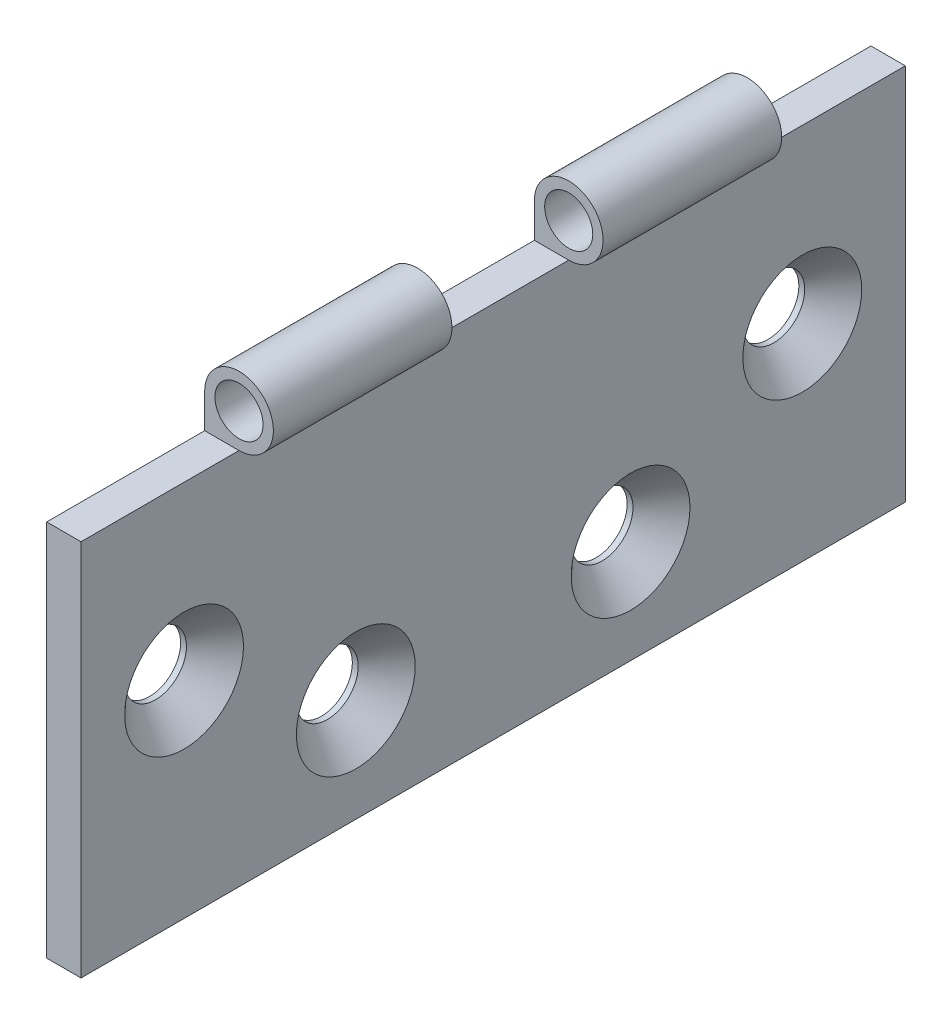
ISO-10303-21;
HEADER;
FILE_DESCRIPTION(('STEP AP214'),'2;1');
FILE_NAME('part.step','',(''),(''),'','','');
FILE_SCHEMA(('AUTOMOTIVE_DESIGN { 1 0 10303 214 1 1 1 1 }'));
ENDSEC;
DATA;
#1=APPLICATION_CONTEXT('core data for automotive mechanical design processes');
#2=APPLICATION_PROTOCOL_DEFINITION('international standard','automotive_design',2000,#1);
#3=PRODUCT_CONTEXT('',#1,'mechanical');
#4=PRODUCT('Part','Part','',(#3));
#5=PRODUCT_RELATED_PRODUCT_CATEGORY('part','',(#4));
#6=PRODUCT_DEFINITION_FORMATION('','',#4);
#7=PRODUCT_DEFINITION_CONTEXT('part definition',#1,'design');
#8=PRODUCT_DEFINITION('design','',#6,#7);
#9=PRODUCT_DEFINITION_SHAPE('','',#8);
#10=(LENGTH_UNIT() NAMED_UNIT(*) SI_UNIT(.MILLI.,.METRE.));
#11=(NAMED_UNIT(*) PLANE_ANGLE_UNIT() SI_UNIT($,.RADIAN.));
#12=(NAMED_UNIT(*) SI_UNIT($,.STERADIAN.) SOLID_ANGLE_UNIT());
#13=UNCERTAINTY_MEASURE_WITH_UNIT(LENGTH_MEASURE(1.E-05),#10,'distance_accuracy_value','');
#14=(GEOMETRIC_REPRESENTATION_CONTEXT(3) GLOBAL_UNCERTAINTY_ASSIGNED_CONTEXT((#13)) GLOBAL_UNIT_ASSIGNED_CONTEXT((#10,
#11,#12)) REPRESENTATION_CONTEXT('',''));
#15=CARTESIAN_POINT('',(0.,0.,0.));
#16=DIRECTION('',(0.,0.,1.));
#17=DIRECTION('',(1.,0.,0.));
#18=AXIS2_PLACEMENT_3D('',#15,#16,#17);
#19=CARTESIAN_POINT('',(0.,0.,60.));
#20=DIRECTION('',(-1.,0.,0.));
#21=DIRECTION('',(0.,0.,1.));
#22=AXIS2_PLACEMENT_3D('',#19,#20,#21);
#23=PLANE('',#22);
#24=CARTESIAN_POINT('',(0.,30.,-45.));
#25=DIRECTION('',(1.,0.,0.));
#26=DIRECTION('',(0.,0.,-1.));
#27=AXIS2_PLACEMENT_3D('',#24,#25,#26);
#28=CIRCLE('',#27,4.5);
#29=CARTESIAN_POINT('',(0.,30.,-49.5));
#30=VERTEX_POINT('',#29);
#31=EDGE_CURVE('E146',#30,#30,#28,.T.);
#32=ORIENTED_EDGE('',*,*,#31,.T.);
#33=EDGE_LOOP('',(#32));
#34=FACE_BOUND('',#33,.T.);
#35=CARTESIAN_POINT('',(0.,15.,-20.));
#36=DIRECTION('',(1.,0.,0.));
#37=DIRECTION('',(0.,0.,-1.));
#38=AXIS2_PLACEMENT_3D('',#35,#36,#37);
#39=CIRCLE('',#38,4.5);
#40=CARTESIAN_POINT('',(0.,15.,-24.5));
#41=VERTEX_POINT('',#40);
#42=EDGE_CURVE('E155',#41,#41,#39,.T.);
#43=ORIENTED_EDGE('',*,*,#42,.T.);
#44=EDGE_LOOP('',(#43));
#45=FACE_BOUND('',#44,.T.);
#46=CARTESIAN_POINT('',(0.,30.,45.));
#47=DIRECTION('',(1.,0.,0.));
#48=DIRECTION('',(0.,0.,-1.));
#49=AXIS2_PLACEMENT_3D('',#46,#47,#48);
#50=CIRCLE('',#49,4.5);
#51=CARTESIAN_POINT('',(0.,30.,40.5));
#52=VERTEX_POINT('',#51);
#53=EDGE_CURVE('E164',#52,#52,#50,.T.);
#54=ORIENTED_EDGE('',*,*,#53,.T.);
#55=EDGE_LOOP('',(#54));
#56=FACE_BOUND('',#55,.T.);
#57=CARTESIAN_POINT('',(0.,15.,20.));
#58=DIRECTION('',(1.,0.,0.));
#59=DIRECTION('',(0.,0.,-1.));
#60=AXIS2_PLACEMENT_3D('',#57,#58,#59);
#61=CIRCLE('',#60,4.5);
#62=CARTESIAN_POINT('',(0.,15.,15.5));
#63=VERTEX_POINT('',#62);
#64=EDGE_CURVE('E173',#63,#63,#61,.T.);
#65=ORIENTED_EDGE('',*,*,#64,.T.);
#66=EDGE_LOOP('',(#65));
#67=FACE_BOUND('',#66,.T.);
#68=DIRECTION('',(0.,0.,1.));
#69=VECTOR('',#68,1.);
#70=CARTESIAN_POINT('',(0.,55.,0.));
#71=LINE('',#70,#69);
#72=CARTESIAN_POINT('',(0.,55.,37.));
#73=VERTEX_POINT('',#72);
#74=CARTESIAN_POINT('',(0.,55.,60.));
#75=VERTEX_POINT('',#74);
#76=EDGE_CURVE('E51',#73,#75,#71,.T.);
#77=ORIENTED_EDGE('',*,*,#76,.F.);
#78=DIRECTION('',(0.,-1.,0.));
#79=VECTOR('',#78,1.);
#80=CARTESIAN_POINT('',(0.,0.,37.));
#81=LINE('',#80,#79);
#82=CARTESIAN_POINT('',(0.,60.,37.));
#83=VERTEX_POINT('',#82);
#84=EDGE_CURVE('E499',#83,#73,#81,.T.);
#85=ORIENTED_EDGE('',*,*,#84,.F.);
#86=DIRECTION('',(0.,0.,-1.));
#87=VECTOR('',#86,1.);
#88=CARTESIAN_POINT('',(0.,60.,60.));
#89=LINE('',#88,#87);
#90=CARTESIAN_POINT('',(0.,60.,11.));
#91=VERTEX_POINT('',#90);
#92=EDGE_CURVE('E11',#83,#91,#89,.T.);
#93=ORIENTED_EDGE('',*,*,#92,.T.);
#94=DIRECTION('',(0.,-1.,0.));
#95=VECTOR('',#94,1.);
#96=CARTESIAN_POINT('',(0.,0.,11.));
#97=LINE('',#96,#95);
#98=CARTESIAN_POINT('',(0.,55.,11.));
#99=VERTEX_POINT('',#98);
#100=EDGE_CURVE('E248',#91,#99,#97,.T.);
#101=ORIENTED_EDGE('',*,*,#100,.T.);
#102=DIRECTION('',(0.,0.,1.));
#103=VECTOR('',#102,1.);
#104=CARTESIAN_POINT('',(0.,55.,0.));
#105=LINE('',#104,#103);
#106=CARTESIAN_POINT('',(0.,55.,-11.));
#107=VERTEX_POINT('',#106);
#108=EDGE_CURVE('E247',#107,#99,#105,.T.);
#109=ORIENTED_EDGE('',*,*,#108,.F.);
#110=DIRECTION('',(0.,-1.,0.));
#111=VECTOR('',#110,1.);
#112=CARTESIAN_POINT('',(0.,0.,-11.));
#113=LINE('',#112,#111);
#114=CARTESIAN_POINT('',(0.,60.,-11.));
#115=VERTEX_POINT('',#114);
#116=EDGE_CURVE('E240',#115,#107,#113,.T.);
#117=ORIENTED_EDGE('',*,*,#116,.F.);
#118=CARTESIAN_POINT('',(0.,60.,-37.));
#119=VERTEX_POINT('',#118);
#120=EDGE_CURVE('E43',#115,#119,#89,.T.);
#121=ORIENTED_EDGE('',*,*,#120,.T.);
#122=DIRECTION('',(0.,-1.,0.));
#123=VECTOR('',#122,1.);
#124=CARTESIAN_POINT('',(0.,0.,-37.));
#125=LINE('',#124,#123);
#126=CARTESIAN_POINT('',(0.,55.,-37.));
#127=VERTEX_POINT('',#126);
#128=EDGE_CURVE('E115',#119,#127,#125,.T.);
#129=ORIENTED_EDGE('',*,*,#128,.T.);
#130=DIRECTION('',(0.,0.,1.));
#131=VECTOR('',#130,1.);
#132=CARTESIAN_POINT('',(0.,55.,0.));
#133=LINE('',#132,#131);
#134=CARTESIAN_POINT('',(0.,55.,-60.));
#135=VERTEX_POINT('',#134);
#136=EDGE_CURVE('E131',#135,#127,#133,.T.);
#137=ORIENTED_EDGE('',*,*,#136,.F.);
#138=DIRECTION('',(0.,1.,0.));
#139=VECTOR('',#138,1.);
#140=CARTESIAN_POINT('',(0.,0.,-60.));
#141=LINE('',#140,#139);
#142=CARTESIAN_POINT('',(0.,0.,-60.));
#143=VERTEX_POINT('',#142);
#144=EDGE_CURVE('E90',#143,#135,#141,.T.);
#145=ORIENTED_EDGE('',*,*,#144,.F.);
#146=DIRECTION('',(0.,0.,-1.));
#147=VECTOR('',#146,1.);
#148=CARTESIAN_POINT('',(0.,0.,60.));
#149=LINE('',#148,#147);
#150=CARTESIAN_POINT('',(0.,0.,60.));
#151=VERTEX_POINT('',#150);
#152=EDGE_CURVE('E79',#151,#143,#149,.T.);
#153=ORIENTED_EDGE('',*,*,#152,.F.);
#154=DIRECTION('',(0.,1.,0.));
#155=VECTOR('',#154,1.);
#156=CARTESIAN_POINT('',(0.,0.,60.));
#157=LINE('',#156,#155);
#158=EDGE_CURVE('E96',#151,#75,#157,.T.);
#159=ORIENTED_EDGE('',*,*,#158,.T.);
#160=EDGE_LOOP('',(#77,#85,#93,#101,#109,#117,#121,#129,#137,#145,#153,#159));
#161=FACE_BOUND('',#160,.T.);
#162=ADVANCED_FACE('F34',(#34,#45,#56,#67,#161),#23,.T.);
#163=CARTESIAN_POINT('',(5.,60.,-60.));
#164=DIRECTION('',(0.,0.,1.));
#165=DIRECTION('',(1.,0.,0.));
#166=AXIS2_PLACEMENT_3D('',#163,#164,#165);
#167=CYLINDRICAL_SURFACE('',#166,5.);
#168=ORIENTED_EDGE('',*,*,#92,.F.);
#169=CARTESIAN_POINT('',(5.,60.,37.));
#170=DIRECTION('',(0.,0.,1.));
#171=DIRECTION('',(0.,-1.,0.));
#172=AXIS2_PLACEMENT_3D('',#169,#170,#171);
#173=CIRCLE('',#172,5.);
#174=CARTESIAN_POINT('',(5.,55.,37.));
#175=VERTEX_POINT('',#174);
#176=EDGE_CURVE('E227',#83,#175,#173,.F.);
#177=ORIENTED_EDGE('',*,*,#176,.T.);
#178=DIRECTION('',(0.,0.,1.));
#179=VECTOR('',#178,1.);
#180=CARTESIAN_POINT('',(5.,55.,-60.));
#181=LINE('',#180,#179);
#182=CARTESIAN_POINT('',(5.,55.,11.));
#183=VERTEX_POINT('',#182);
#184=EDGE_CURVE('E176',#183,#175,#181,.T.);
#185=ORIENTED_EDGE('',*,*,#184,.F.);
#186=CARTESIAN_POINT('',(5.,60.,11.));
#187=DIRECTION('',(0.,0.,1.));
#188=DIRECTION('',(1.,0.,0.));
#189=AXIS2_PLACEMENT_3D('',#186,#187,#188);
#190=CIRCLE('',#189,5.);
#191=EDGE_CURVE('E107',#91,#183,#190,.F.);
#192=ORIENTED_EDGE('',*,*,#191,.F.);
#193=EDGE_LOOP('',(#168,#177,#185,#192));
#194=FACE_BOUND('',#193,.T.);
#195=ADVANCED_FACE('F225',(#194),#167,.T.);
#196=CARTESIAN_POINT('',(0.,0.,60.));
#197=DIRECTION('',(0.,0.,-1.));
#198=DIRECTION('',(-1.,0.,0.));
#199=AXIS2_PLACEMENT_3D('',#196,#197,#198);
#200=PLANE('',#199);
#201=DIRECTION('',(1.,0.,0.));
#202=VECTOR('',#201,1.);
#203=CARTESIAN_POINT('',(0.,55.,60.));
#204=LINE('',#203,#202);
#205=CARTESIAN_POINT('',(5.,55.,60.));
#206=VERTEX_POINT('',#205);
#207=EDGE_CURVE('E185',#75,#206,#204,.T.);
#208=ORIENTED_EDGE('',*,*,#207,.F.);
#209=ORIENTED_EDGE('',*,*,#158,.F.);
#210=DIRECTION('',(-1.,0.,0.));
#211=VECTOR('',#210,1.);
#212=CARTESIAN_POINT('',(5.,0.,60.));
#213=LINE('',#212,#211);
#214=CARTESIAN_POINT('',(5.,0.,60.));
#215=VERTEX_POINT('',#214);
#216=EDGE_CURVE('E80',#215,#151,#213,.T.);
#217=ORIENTED_EDGE('',*,*,#216,.F.);
#218=DIRECTION('',(0.,1.,0.));
#219=VECTOR('',#218,1.);
#220=CARTESIAN_POINT('',(5.,0.,60.));
#221=LINE('',#220,#219);
#222=EDGE_CURVE('E77',#215,#206,#221,.T.);
#223=ORIENTED_EDGE('',*,*,#222,.T.);
#224=EDGE_LOOP('',(#208,#209,#217,#223));
#225=FACE_BOUND('',#224,.T.);
#226=ADVANCED_FACE('F183',(#225),#200,.F.);
#227=CARTESIAN_POINT('',(5.,60.,-60.));
#228=DIRECTION('',(0.,0.,1.));
#229=DIRECTION('',(1.,0.,0.));
#230=AXIS2_PLACEMENT_3D('',#227,#228,#229);
#231=CYLINDRICAL_SURFACE('',#230,3.5);
#232=CARTESIAN_POINT('',(5.,60.,11.));
#233=DIRECTION('',(0.,0.,1.));
#234=DIRECTION('',(1.,0.,0.));
#235=AXIS2_PLACEMENT_3D('',#232,#233,#234);
#236=CIRCLE('',#235,3.5);
#237=CARTESIAN_POINT('',(8.5,60.,11.));
#238=VERTEX_POINT('',#237);
#239=EDGE_CURVE('E105',#238,#238,#236,.F.);
#240=ORIENTED_EDGE('',*,*,#239,.T.);
#241=EDGE_LOOP('',(#240));
#242=FACE_BOUND('',#241,.T.);
#243=CARTESIAN_POINT('',(5.,60.,37.));
#244=DIRECTION('',(0.,0.,1.));
#245=DIRECTION('',(0.,-1.,0.));
#246=AXIS2_PLACEMENT_3D('',#243,#244,#245);
#247=CIRCLE('',#246,3.5);
#248=CARTESIAN_POINT('',(5.,56.5,37.));
#249=VERTEX_POINT('',#248);
#250=EDGE_CURVE('E38',#249,#249,#247,.F.);
#251=ORIENTED_EDGE('',*,*,#250,.F.);
#252=EDGE_LOOP('',(#251));
#253=FACE_BOUND('',#252,.T.);
#254=ADVANCED_FACE('F263',(#242,#253),#231,.F.);
#255=CARTESIAN_POINT('',(5.,60.,-11.));
#256=DIRECTION('',(0.,0.,1.));
#257=DIRECTION('',(1.,0.,0.));
#258=AXIS2_PLACEMENT_3D('',#255,#256,#257);
#259=CIRCLE('',#258,5.);
#260=CARTESIAN_POINT('',(5.,55.,-11.));
#261=VERTEX_POINT('',#260);
#262=EDGE_CURVE('E111',#115,#261,#259,.F.);
#263=ORIENTED_EDGE('',*,*,#262,.T.);
#264=CARTESIAN_POINT('',(5.,55.,-37.));
#265=VERTEX_POINT('',#264);
#266=EDGE_CURVE('E177',#265,#261,#181,.T.);
#267=ORIENTED_EDGE('',*,*,#266,.F.);
#268=CARTESIAN_POINT('',(5.,60.,-37.));
#269=DIRECTION('',(0.,0.,1.));
#270=DIRECTION('',(0.,-1.,0.));
#271=AXIS2_PLACEMENT_3D('',#268,#269,#270);
#272=CIRCLE('',#271,5.);
#273=EDGE_CURVE('E104',#119,#265,#272,.F.);
#274=ORIENTED_EDGE('',*,*,#273,.F.);
#275=ORIENTED_EDGE('',*,*,#120,.F.);
#276=EDGE_LOOP('',(#263,#267,#274,#275));
#277=FACE_BOUND('',#276,.T.);
#278=ADVANCED_FACE('F250',(#277),#167,.T.);
#279=CARTESIAN_POINT('',(5.,60.,-37.));
#280=DIRECTION('',(0.,0.,1.));
#281=DIRECTION('',(0.,-1.,0.));
#282=AXIS2_PLACEMENT_3D('',#279,#280,#281);
#283=CIRCLE('',#282,3.5);
#284=CARTESIAN_POINT('',(5.,56.5,-37.));
#285=VERTEX_POINT('',#284);
#286=EDGE_CURVE('E101',#285,#285,#283,.F.);
#287=ORIENTED_EDGE('',*,*,#286,.T.);
#288=EDGE_LOOP('',(#287));
#289=FACE_BOUND('',#288,.T.);
#290=CARTESIAN_POINT('',(5.,60.,-11.));
#291=DIRECTION('',(0.,0.,1.));
#292=DIRECTION('',(1.,0.,0.));
#293=AXIS2_PLACEMENT_3D('',#290,#291,#292);
#294=CIRCLE('',#293,3.5);
#295=CARTESIAN_POINT('',(8.5,60.,-11.));
#296=VERTEX_POINT('',#295);
#297=EDGE_CURVE('E109',#296,#296,#294,.F.);
#298=ORIENTED_EDGE('',*,*,#297,.F.);
#299=EDGE_LOOP('',(#298));
#300=FACE_BOUND('',#299,.T.);
#301=ADVANCED_FACE('F259',(#289,#300),#231,.F.);
#302=CARTESIAN_POINT('',(0.,0.,-60.));
#303=DIRECTION('',(0.,0.,-1.));
#304=DIRECTION('',(-1.,0.,0.));
#305=AXIS2_PLACEMENT_3D('',#302,#303,#304);
#306=PLANE('',#305);
#307=ORIENTED_EDGE('',*,*,#144,.T.);
#308=DIRECTION('',(1.,0.,0.));
#309=VECTOR('',#308,1.);
#310=CARTESIAN_POINT('',(0.,55.,-60.));
#311=LINE('',#310,#309);
#312=CARTESIAN_POINT('',(5.,55.,-60.));
#313=VERTEX_POINT('',#312);
#314=EDGE_CURVE('E89',#135,#313,#311,.T.);
#315=ORIENTED_EDGE('',*,*,#314,.T.);
#316=DIRECTION('',(0.,1.,0.));
#317=VECTOR('',#316,1.);
#318=CARTESIAN_POINT('',(5.,0.,-60.));
#319=LINE('',#318,#317);
#320=CARTESIAN_POINT('',(5.,0.,-60.));
#321=VERTEX_POINT('',#320);
#322=EDGE_CURVE('E74',#321,#313,#319,.T.);
#323=ORIENTED_EDGE('',*,*,#322,.F.);
#324=DIRECTION('',(-1.,0.,0.));
#325=VECTOR('',#324,1.);
#326=CARTESIAN_POINT('',(5.,0.,-60.));
#327=LINE('',#326,#325);
#328=EDGE_CURVE('E87',#321,#143,#327,.T.);
#329=ORIENTED_EDGE('',*,*,#328,.T.);
#330=EDGE_LOOP('',(#307,#315,#323,#329));
#331=FACE_BOUND('',#330,.T.);
#332=ADVANCED_FACE('F86',(#331),#306,.T.);
#333=CARTESIAN_POINT('',(5.,0.,60.));
#334=DIRECTION('',(-1.,0.,0.));
#335=DIRECTION('',(0.,0.,1.));
#336=AXIS2_PLACEMENT_3D('',#333,#334,#335);
#337=PLANE('',#336);
#338=CARTESIAN_POINT('',(5.,30.,-45.));
#339=DIRECTION('',(1.,0.,0.));
#340=DIRECTION('',(0.,0.,-1.));
#341=AXIS2_PLACEMENT_3D('',#338,#339,#340);
#342=CIRCLE('',#341,8.65);
#343=CARTESIAN_POINT('',(5.,30.,-53.65));
#344=VERTEX_POINT('',#343);
#345=EDGE_CURVE('E140',#344,#344,#342,.T.);
#346=ORIENTED_EDGE('',*,*,#345,.F.);
#347=EDGE_LOOP('',(#346));
#348=FACE_BOUND('',#347,.T.);
#349=CARTESIAN_POINT('',(5.,15.,-20.));
#350=DIRECTION('',(1.,0.,0.));
#351=DIRECTION('',(0.,0.,-1.));
#352=AXIS2_PLACEMENT_3D('',#349,#350,#351);
#353=CIRCLE('',#352,8.65);
#354=CARTESIAN_POINT('',(5.,15.,-28.65));
#355=VERTEX_POINT('',#354);
#356=EDGE_CURVE('E149',#355,#355,#353,.T.);
#357=ORIENTED_EDGE('',*,*,#356,.F.);
#358=EDGE_LOOP('',(#357));
#359=FACE_BOUND('',#358,.T.);
#360=CARTESIAN_POINT('',(5.,30.,45.));
#361=DIRECTION('',(1.,0.,0.));
#362=DIRECTION('',(0.,0.,-1.));
#363=AXIS2_PLACEMENT_3D('',#360,#361,#362);
#364=CIRCLE('',#363,8.65);
#365=CARTESIAN_POINT('',(5.,30.,36.35));
#366=VERTEX_POINT('',#365);
#367=EDGE_CURVE('E158',#366,#366,#364,.T.);
#368=ORIENTED_EDGE('',*,*,#367,.F.);
#369=EDGE_LOOP('',(#368));
#370=FACE_BOUND('',#369,.T.);
#371=CARTESIAN_POINT('',(5.,15.,20.));
#372=DIRECTION('',(1.,0.,0.));
#373=DIRECTION('',(0.,0.,-1.));
#374=AXIS2_PLACEMENT_3D('',#371,#372,#373);
#375=CIRCLE('',#374,8.65);
#376=CARTESIAN_POINT('',(5.,15.,11.35));
#377=VERTEX_POINT('',#376);
#378=EDGE_CURVE('E167',#377,#377,#375,.T.);
#379=ORIENTED_EDGE('',*,*,#378,.F.);
#380=EDGE_LOOP('',(#379));
#381=FACE_BOUND('',#380,.T.);
#382=ORIENTED_EDGE('',*,*,#322,.T.);
#383=EDGE_CURVE('E91',#313,#265,#181,.T.);
#384=ORIENTED_EDGE('',*,*,#383,.T.);
#385=ORIENTED_EDGE('',*,*,#266,.T.);
#386=EDGE_CURVE('E211',#261,#183,#181,.T.);
#387=ORIENTED_EDGE('',*,*,#386,.T.);
#388=ORIENTED_EDGE('',*,*,#184,.T.);
#389=DIRECTION('',(0.,0.,-1.));
#390=VECTOR('',#389,1.);
#391=CARTESIAN_POINT('',(5.,55.,60.));
#392=LINE('',#391,#390);
#393=EDGE_CURVE('E219',#206,#175,#392,.T.);
#394=ORIENTED_EDGE('',*,*,#393,.F.);
#395=ORIENTED_EDGE('',*,*,#222,.F.);
#396=DIRECTION('',(0.,0.,-1.));
#397=VECTOR('',#396,1.);
#398=CARTESIAN_POINT('',(5.,0.,60.));
#399=LINE('',#398,#397);
#400=EDGE_CURVE('E60',#215,#321,#399,.T.);
#401=ORIENTED_EDGE('',*,*,#400,.T.);
#402=EDGE_LOOP('',(#382,#384,#385,#387,#388,#394,#395,#401));
#403=FACE_BOUND('',#402,.T.);
#404=ADVANCED_FACE('F36',(#348,#359,#370,#381,#403),#337,.F.);
#405=CARTESIAN_POINT('',(5.,0.,60.));
#406=DIRECTION('',(0.,-1.,0.));
#407=DIRECTION('',(0.,0.,-1.));
#408=AXIS2_PLACEMENT_3D('',#405,#406,#407);
#409=PLANE('',#408);
#410=ORIENTED_EDGE('',*,*,#328,.F.);
#411=ORIENTED_EDGE('',*,*,#400,.F.);
#412=ORIENTED_EDGE('',*,*,#216,.T.);
#413=ORIENTED_EDGE('',*,*,#152,.T.);
#414=EDGE_LOOP('',(#410,#411,#412,#413));
#415=FACE_BOUND('',#414,.T.);
#416=ADVANCED_FACE('F93',(#415),#409,.T.);
#417=CARTESIAN_POINT('',(5.,15.,20.));
#418=DIRECTION('',(1.,0.,0.));
#419=DIRECTION('',(0.,0.,-1.));
#420=AXIS2_PLACEMENT_3D('',#417,#418,#419);
#421=CYLINDRICAL_SURFACE('',#420,4.5);
#422=ORIENTED_EDGE('',*,*,#64,.F.);
#423=EDGE_LOOP('',(#422));
#424=FACE_BOUND('',#423,.T.);
#425=CARTESIAN_POINT('',(0.850000000000003,15.,20.));
#426=DIRECTION('',(1.,0.,0.));
#427=DIRECTION('',(0.,0.,-1.));
#428=AXIS2_PLACEMENT_3D('',#425,#426,#427);
#429=CIRCLE('',#428,4.5);
#430=CARTESIAN_POINT('',(0.850000000000003,15.,15.5));
#431=VERTEX_POINT('',#430);
#432=EDGE_CURVE('E170',#431,#431,#429,.T.);
#433=ORIENTED_EDGE('',*,*,#432,.T.);
#434=EDGE_LOOP('',(#433));
#435=FACE_BOUND('',#434,.T.);
#436=ADVANCED_FACE('F282',(#424,#435),#421,.F.);
#437=CARTESIAN_POINT('',(5.,15.,20.));
#438=DIRECTION('',(1.,0.,0.));
#439=DIRECTION('',(0.,0.,-1.));
#440=AXIS2_PLACEMENT_3D('',#437,#438,#439);
#441=CONICAL_SURFACE('',#440,8.65,0.785398163397448);
#442=ORIENTED_EDGE('',*,*,#432,.F.);
#443=EDGE_LOOP('',(#442));
#444=FACE_BOUND('',#443,.T.);
#445=ORIENTED_EDGE('',*,*,#378,.T.);
#446=EDGE_LOOP('',(#445));
#447=FACE_BOUND('',#446,.T.);
#448=ADVANCED_FACE('F412',(#444,#447),#441,.F.);
#449=CARTESIAN_POINT('',(5.,30.,45.));
#450=DIRECTION('',(1.,0.,0.));
#451=DIRECTION('',(0.,0.,-1.));
#452=AXIS2_PLACEMENT_3D('',#449,#450,#451);
#453=CYLINDRICAL_SURFACE('',#452,4.5);
#454=ORIENTED_EDGE('',*,*,#53,.F.);
#455=EDGE_LOOP('',(#454));
#456=FACE_BOUND('',#455,.T.);
#457=CARTESIAN_POINT('',(0.850000000000003,30.,45.));
#458=DIRECTION('',(1.,0.,0.));
#459=DIRECTION('',(0.,0.,-1.));
#460=AXIS2_PLACEMENT_3D('',#457,#458,#459);
#461=CIRCLE('',#460,4.5);
#462=CARTESIAN_POINT('',(0.850000000000003,30.,40.5));
#463=VERTEX_POINT('',#462);
#464=EDGE_CURVE('E161',#463,#463,#461,.T.);
#465=ORIENTED_EDGE('',*,*,#464,.T.);
#466=EDGE_LOOP('',(#465));
#467=FACE_BOUND('',#466,.T.);
#468=ADVANCED_FACE('F408',(#456,#467),#453,.F.);
#469=CARTESIAN_POINT('',(5.,30.,45.));
#470=DIRECTION('',(1.,0.,0.));
#471=DIRECTION('',(0.,0.,-1.));
#472=AXIS2_PLACEMENT_3D('',#469,#470,#471);
#473=CONICAL_SURFACE('',#472,8.65,0.785398163397449);
#474=ORIENTED_EDGE('',*,*,#464,.F.);
#475=EDGE_LOOP('',(#474));
#476=FACE_BOUND('',#475,.T.);
#477=ORIENTED_EDGE('',*,*,#367,.T.);
#478=EDGE_LOOP('',(#477));
#479=FACE_BOUND('',#478,.T.);
#480=ADVANCED_FACE('F404',(#476,#479),#473,.F.);
#481=CARTESIAN_POINT('',(5.,15.,-20.));
#482=DIRECTION('',(1.,0.,0.));
#483=DIRECTION('',(0.,0.,-1.));
#484=AXIS2_PLACEMENT_3D('',#481,#482,#483);
#485=CYLINDRICAL_SURFACE('',#484,4.5);
#486=ORIENTED_EDGE('',*,*,#42,.F.);
#487=EDGE_LOOP('',(#486));
#488=FACE_BOUND('',#487,.T.);
#489=CARTESIAN_POINT('',(0.850000000000003,15.,-20.));
#490=DIRECTION('',(1.,0.,0.));
#491=DIRECTION('',(0.,0.,-1.));
#492=AXIS2_PLACEMENT_3D('',#489,#490,#491);
#493=CIRCLE('',#492,4.5);
#494=CARTESIAN_POINT('',(0.850000000000003,15.,-24.5));
#495=VERTEX_POINT('',#494);
#496=EDGE_CURVE('E152',#495,#495,#493,.T.);
#497=ORIENTED_EDGE('',*,*,#496,.T.);
#498=EDGE_LOOP('',(#497));
#499=FACE_BOUND('',#498,.T.);
#500=ADVANCED_FACE('F400',(#488,#499),#485,.F.);
#501=CARTESIAN_POINT('',(5.,15.,-20.));
#502=DIRECTION('',(1.,0.,0.));
#503=DIRECTION('',(0.,0.,-1.));
#504=AXIS2_PLACEMENT_3D('',#501,#502,#503);
#505=CONICAL_SURFACE('',#504,8.65,0.785398163397448);
#506=ORIENTED_EDGE('',*,*,#496,.F.);
#507=EDGE_LOOP('',(#506));
#508=FACE_BOUND('',#507,.T.);
#509=ORIENTED_EDGE('',*,*,#356,.T.);
#510=EDGE_LOOP('',(#509));
#511=FACE_BOUND('',#510,.T.);
#512=ADVANCED_FACE('F396',(#508,#511),#505,.F.);
#513=CARTESIAN_POINT('',(5.,30.,-45.));
#514=DIRECTION('',(1.,0.,0.));
#515=DIRECTION('',(0.,0.,-1.));
#516=AXIS2_PLACEMENT_3D('',#513,#514,#515);
#517=CYLINDRICAL_SURFACE('',#516,4.5);
#518=ORIENTED_EDGE('',*,*,#31,.F.);
#519=EDGE_LOOP('',(#518));
#520=FACE_BOUND('',#519,.T.);
#521=CARTESIAN_POINT('',(0.850000000000003,30.,-45.));
#522=DIRECTION('',(1.,0.,0.));
#523=DIRECTION('',(0.,0.,-1.));
#524=AXIS2_PLACEMENT_3D('',#521,#522,#523);
#525=CIRCLE('',#524,4.5);
#526=CARTESIAN_POINT('',(0.850000000000003,30.,-49.5));
#527=VERTEX_POINT('',#526);
#528=EDGE_CURVE('E143',#527,#527,#525,.T.);
#529=ORIENTED_EDGE('',*,*,#528,.T.);
#530=EDGE_LOOP('',(#529));
#531=FACE_BOUND('',#530,.T.);
#532=ADVANCED_FACE('F392',(#520,#531),#517,.F.);
#533=CARTESIAN_POINT('',(5.,30.,-45.));
#534=DIRECTION('',(1.,0.,0.));
#535=DIRECTION('',(0.,0.,-1.));
#536=AXIS2_PLACEMENT_3D('',#533,#534,#535);
#537=CONICAL_SURFACE('',#536,8.65,0.785398163397449);
#538=ORIENTED_EDGE('',*,*,#528,.F.);
#539=EDGE_LOOP('',(#538));
#540=FACE_BOUND('',#539,.T.);
#541=ORIENTED_EDGE('',*,*,#345,.T.);
#542=EDGE_LOOP('',(#541));
#543=FACE_BOUND('',#542,.T.);
#544=ADVANCED_FACE('F328',(#540,#543),#537,.F.);
#545=CARTESIAN_POINT('',(0.,55.,0.));
#546=DIRECTION('',(0.,1.,0.));
#547=DIRECTION('',(0.,0.,1.));
#548=AXIS2_PLACEMENT_3D('',#545,#546,#547);
#549=PLANE('',#548);
#550=ORIENTED_EDGE('',*,*,#383,.F.);
#551=ORIENTED_EDGE('',*,*,#314,.F.);
#552=ORIENTED_EDGE('',*,*,#136,.T.);
#553=DIRECTION('',(1.,0.,0.));
#554=VECTOR('',#553,1.);
#555=CARTESIAN_POINT('',(0.,55.,-37.));
#556=LINE('',#555,#554);
#557=EDGE_CURVE('E134',#127,#265,#556,.T.);
#558=ORIENTED_EDGE('',*,*,#557,.T.);
#559=EDGE_LOOP('',(#550,#551,#552,#558));
#560=FACE_BOUND('',#559,.T.);
#561=ADVANCED_FACE('F203',(#560),#549,.T.);
#562=CARTESIAN_POINT('',(0.,0.,-37.));
#563=DIRECTION('',(0.,0.,1.));
#564=DIRECTION('',(0.,-1.,0.));
#565=AXIS2_PLACEMENT_3D('',#562,#563,#564);
#566=PLANE('',#565);
#567=ORIENTED_EDGE('',*,*,#273,.T.);
#568=ORIENTED_EDGE('',*,*,#557,.F.);
#569=ORIENTED_EDGE('',*,*,#128,.F.);
#570=EDGE_LOOP('',(#567,#568,#569));
#571=FACE_BOUND('',#570,.T.);
#572=ORIENTED_EDGE('',*,*,#286,.F.);
#573=EDGE_LOOP('',(#572));
#574=FACE_BOUND('',#573,.T.);
#575=ADVANCED_FACE('F252',(#571,#574),#566,.F.);
#576=CARTESIAN_POINT('',(0.,55.,0.));
#577=DIRECTION('',(0.,1.,0.));
#578=DIRECTION('',(0.,0.,1.));
#579=AXIS2_PLACEMENT_3D('',#576,#577,#578);
#580=PLANE('',#579);
#581=ORIENTED_EDGE('',*,*,#386,.F.);
#582=DIRECTION('',(1.,0.,0.));
#583=VECTOR('',#582,1.);
#584=CARTESIAN_POINT('',(0.,55.,-11.));
#585=LINE('',#584,#583);
#586=EDGE_CURVE('E108',#107,#261,#585,.T.);
#587=ORIENTED_EDGE('',*,*,#586,.F.);
#588=ORIENTED_EDGE('',*,*,#108,.T.);
#589=DIRECTION('',(1.,0.,0.));
#590=VECTOR('',#589,1.);
#591=CARTESIAN_POINT('',(0.,55.,11.));
#592=LINE('',#591,#590);
#593=EDGE_CURVE('E126',#99,#183,#592,.T.);
#594=ORIENTED_EDGE('',*,*,#593,.T.);
#595=EDGE_LOOP('',(#581,#587,#588,#594));
#596=FACE_BOUND('',#595,.T.);
#597=ADVANCED_FACE('F255',(#596),#580,.T.);
#598=CARTESIAN_POINT('',(0.,0.,-11.));
#599=DIRECTION('',(0.,0.,1.));
#600=DIRECTION('',(1.,0.,0.));
#601=AXIS2_PLACEMENT_3D('',#598,#599,#600);
#602=PLANE('',#601);
#603=ORIENTED_EDGE('',*,*,#262,.F.);
#604=ORIENTED_EDGE('',*,*,#116,.T.);
#605=ORIENTED_EDGE('',*,*,#586,.T.);
#606=EDGE_LOOP('',(#603,#604,#605));
#607=FACE_BOUND('',#606,.T.);
#608=ORIENTED_EDGE('',*,*,#297,.T.);
#609=EDGE_LOOP('',(#608));
#610=FACE_BOUND('',#609,.T.);
#611=ADVANCED_FACE('F239',(#607,#610),#602,.T.);
#612=CARTESIAN_POINT('',(0.,0.,11.));
#613=DIRECTION('',(0.,0.,1.));
#614=DIRECTION('',(1.,0.,0.));
#615=AXIS2_PLACEMENT_3D('',#612,#613,#614);
#616=PLANE('',#615);
#617=ORIENTED_EDGE('',*,*,#191,.T.);
#618=ORIENTED_EDGE('',*,*,#593,.F.);
#619=ORIENTED_EDGE('',*,*,#100,.F.);
#620=EDGE_LOOP('',(#617,#618,#619));
#621=FACE_BOUND('',#620,.T.);
#622=ORIENTED_EDGE('',*,*,#239,.F.);
#623=EDGE_LOOP('',(#622));
#624=FACE_BOUND('',#623,.T.);
#625=ADVANCED_FACE('F355',(#621,#624),#616,.F.);
#626=CARTESIAN_POINT('',(0.,55.,0.));
#627=DIRECTION('',(0.,1.,0.));
#628=DIRECTION('',(0.,0.,1.));
#629=AXIS2_PLACEMENT_3D('',#626,#627,#628);
#630=PLANE('',#629);
#631=ORIENTED_EDGE('',*,*,#393,.T.);
#632=DIRECTION('',(1.,0.,0.));
#633=VECTOR('',#632,1.);
#634=CARTESIAN_POINT('',(0.,55.,37.));
#635=LINE('',#634,#633);
#636=EDGE_CURVE('E503',#73,#175,#635,.T.);
#637=ORIENTED_EDGE('',*,*,#636,.F.);
#638=ORIENTED_EDGE('',*,*,#76,.T.);
#639=ORIENTED_EDGE('',*,*,#207,.T.);
#640=EDGE_LOOP('',(#631,#637,#638,#639));
#641=FACE_BOUND('',#640,.T.);
#642=ADVANCED_FACE('F364',(#641),#630,.T.);
#643=CARTESIAN_POINT('',(0.,0.,37.));
#644=DIRECTION('',(0.,0.,1.));
#645=DIRECTION('',(0.,-1.,0.));
#646=AXIS2_PLACEMENT_3D('',#643,#644,#645);
#647=PLANE('',#646);
#648=ORIENTED_EDGE('',*,*,#84,.T.);
#649=ORIENTED_EDGE('',*,*,#636,.T.);
#650=ORIENTED_EDGE('',*,*,#176,.F.);
#651=EDGE_LOOP('',(#648,#649,#650));
#652=FACE_BOUND('',#651,.T.);
#653=ORIENTED_EDGE('',*,*,#250,.T.);
#654=EDGE_LOOP('',(#653));
#655=FACE_BOUND('',#654,.T.);
#656=ADVANCED_FACE('F374',(#652,#655),#647,.T.);
#657=CLOSED_SHELL('',(#162,#195,#226,#254,#278,#301,#332,#404,#416,#436,#448,#468,#480,#500,
#512,#532,#544,#561,#575,#597,#611,#625,#642,#656));
#658=MANIFOLD_SOLID_BREP('B2',#657);
#659=ADVANCED_BREP_SHAPE_REPRESENTATION('',(#18,#658),#14);
#660=SHAPE_DEFINITION_REPRESENTATION(#9,#659);
ENDSEC;
END-ISO-10303-21;
